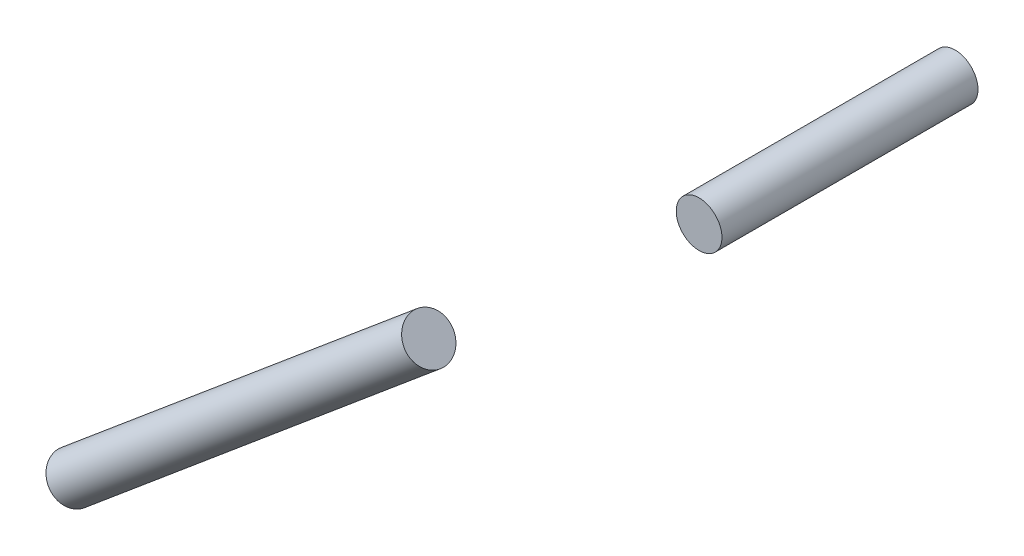
ISO-10303-21;
HEADER;
FILE_DESCRIPTION(('STEP AP214'),'2;1');
FILE_NAME('part.step','',(''),(''),'','','');
FILE_SCHEMA(('AUTOMOTIVE_DESIGN { 1 0 10303 214 1 1 1 1 }'));
ENDSEC;
DATA;
#1=APPLICATION_CONTEXT('core data for automotive mechanical design processes');
#2=APPLICATION_PROTOCOL_DEFINITION('international standard','automotive_design',2000,#1);
#3=PRODUCT_CONTEXT('',#1,'mechanical');
#4=PRODUCT('Part','Part','',(#3));
#5=PRODUCT_RELATED_PRODUCT_CATEGORY('part','',(#4));
#6=PRODUCT_DEFINITION_FORMATION('','',#4);
#7=PRODUCT_DEFINITION_CONTEXT('part definition',#1,'design');
#8=PRODUCT_DEFINITION('design','',#6,#7);
#9=PRODUCT_DEFINITION_SHAPE('','',#8);
#10=(LENGTH_UNIT() NAMED_UNIT(*) SI_UNIT(.MILLI.,.METRE.));
#11=(NAMED_UNIT(*) PLANE_ANGLE_UNIT() SI_UNIT($,.RADIAN.));
#12=(NAMED_UNIT(*) SI_UNIT($,.STERADIAN.) SOLID_ANGLE_UNIT());
#13=UNCERTAINTY_MEASURE_WITH_UNIT(LENGTH_MEASURE(1.E-05),#10,'distance_accuracy_value','');
#14=(GEOMETRIC_REPRESENTATION_CONTEXT(3) GLOBAL_UNCERTAINTY_ASSIGNED_CONTEXT((#13)) GLOBAL_UNIT_ASSIGNED_CONTEXT((#10,
#11,#12)) REPRESENTATION_CONTEXT('',''));
#15=CARTESIAN_POINT('',(0.,0.,0.));
#16=DIRECTION('',(0.,0.,1.));
#17=DIRECTION('',(1.,0.,0.));
#18=AXIS2_PLACEMENT_3D('',#15,#16,#17);
#19=CARTESIAN_POINT('',(0.,0.,-22.86));
#20=DIRECTION('',(0.,0.,-1.));
#21=DIRECTION('',(-1.,0.,0.));
#22=AXIS2_PLACEMENT_3D('',#19,#20,#21);
#23=PLANE('',#22);
#24=CARTESIAN_POINT('',(0.,0.,-22.86));
#25=DIRECTION('',(0.,0.,-1.));
#26=DIRECTION('',(-1.,0.,0.));
#27=AXIS2_PLACEMENT_3D('',#24,#25,#26);
#28=CIRCLE('',#27,6.35);
#29=CARTESIAN_POINT('',(-6.34999999999997,0.,-22.86));
#30=VERTEX_POINT('',#29);
#31=EDGE_CURVE('E11',#30,#30,#28,.F.);
#32=ORIENTED_EDGE('',*,*,#31,.F.);
#33=EDGE_LOOP('',(#32));
#34=FACE_BOUND('',#33,.T.);
#35=ADVANCED_FACE('F42',(#34),#23,.T.);
#36=CARTESIAN_POINT('',(0.,0.,48.2981000000004));
#37=DIRECTION('',(0.,0.,1.));
#38=DIRECTION('',(1.,0.,0.));
#39=AXIS2_PLACEMENT_3D('',#36,#37,#38);
#40=PLANE('',#39);
#41=CARTESIAN_POINT('',(0.,0.,48.2981000000004));
#42=DIRECTION('',(0.,0.,1.));
#43=DIRECTION('',(1.,0.,0.));
#44=AXIS2_PLACEMENT_3D('',#41,#42,#43);
#45=CIRCLE('',#44,6.35);
#46=CARTESIAN_POINT('',(6.35000000000004,0.,48.2981000000004));
#47=VERTEX_POINT('',#46);
#48=EDGE_CURVE('E48',#47,#47,#45,.T.);
#49=ORIENTED_EDGE('',*,*,#48,.T.);
#50=EDGE_LOOP('',(#49));
#51=FACE_BOUND('',#50,.T.);
#52=ADVANCED_FACE('F54',(#51),#40,.T.);
#53=CARTESIAN_POINT('',(0.,0.,-40.8205122421383));
#54=DIRECTION('',(0.,0.,1.));
#55=DIRECTION('',(1.,0.,0.));
#56=AXIS2_PLACEMENT_3D('',#53,#54,#55);
#57=CYLINDRICAL_SURFACE('',#56,6.35);
#58=ORIENTED_EDGE('',*,*,#48,.F.);
#59=EDGE_LOOP('',(#58));
#60=FACE_BOUND('',#59,.T.);
#61=ORIENTED_EDGE('',*,*,#31,.T.);
#62=EDGE_LOOP('',(#61));
#63=FACE_BOUND('',#62,.T.);
#64=ADVANCED_FACE('F56',(#60,#63),#57,.T.);
#65=CLOSED_SHELL('',(#35,#52,#64));
#66=MANIFOLD_SOLID_BREP('B2',#65);
#67=CARTESIAN_POINT('',(-48.1361902539463,-40.350838680155,61.5061000000004));
#68=DIRECTION('',(-0.766359657639559,-0.642411764480211,0.));
#69=DIRECTION('',(0.642411764480211,-0.766359657639559,0.));
#70=AXIS2_PLACEMENT_3D('',#67,#68,#69);
#71=CYLINDRICAL_SURFACE('',#70,6.35000000000001);
#72=CARTESIAN_POINT('',(-160.717192237846,-134.723447429144,61.5061000000003));
#73=DIRECTION('',(0.766359657639559,0.642411764480211,0.));
#74=DIRECTION('',(-0.642411764480211,0.766359657639559,0.));
#75=AXIS2_PLACEMENT_3D('',#72,#73,#74);
#76=CIRCLE('',#75,6.35000000000001);
#77=CARTESIAN_POINT('',(-164.796506942295,-129.857063603132,61.5061000000003));
#78=VERTEX_POINT('',#77);
#79=EDGE_CURVE('E98',#78,#78,#76,.T.);
#80=ORIENTED_EDGE('',*,*,#79,.T.);
#81=EDGE_LOOP('',(#80));
#82=FACE_BOUND('',#81,.T.);
#83=CARTESIAN_POINT('',(-61.9004022668625,-51.8888830405955,61.5061000000004));
#84=DIRECTION('',(0.76635965763956,0.64241176448021,0.));
#85=DIRECTION('',(-0.64241176448021,0.76635965763956,0.));
#86=AXIS2_PLACEMENT_3D('',#83,#84,#85);
#87=CIRCLE('',#86,6.35000000000001);
#88=CARTESIAN_POINT('',(-65.9797169713119,-47.0224992145843,61.5061000000004));
#89=VERTEX_POINT('',#88);
#90=EDGE_CURVE('E41',#89,#89,#87,.T.);
#91=ORIENTED_EDGE('',*,*,#90,.F.);
#92=EDGE_LOOP('',(#91));
#93=FACE_BOUND('',#92,.T.);
#94=ADVANCED_FACE('F91',(#82,#93),#71,.T.);
#95=CARTESIAN_POINT('',(-160.717192237846,-134.723447429144,61.5061000000003));
#96=DIRECTION('',(0.766359657639559,0.642411764480211,0.));
#97=DIRECTION('',(-0.642411764480211,0.766359657639559,0.));
#98=AXIS2_PLACEMENT_3D('',#95,#96,#97);
#99=PLANE('',#98);
#100=ORIENTED_EDGE('',*,*,#79,.F.);
#101=EDGE_LOOP('',(#100));
#102=FACE_BOUND('',#101,.T.);
#103=ADVANCED_FACE('F106',(#102),#99,.F.);
#104=CARTESIAN_POINT('',(-61.9004022668625,-51.8888830405955,0.));
#105=DIRECTION('',(0.76635965763956,0.64241176448021,0.));
#106=DIRECTION('',(-0.64241176448021,0.76635965763956,0.));
#107=AXIS2_PLACEMENT_3D('',#104,#105,#106);
#108=PLANE('',#107);
#109=ORIENTED_EDGE('',*,*,#90,.T.);
#110=EDGE_LOOP('',(#109));
#111=FACE_BOUND('',#110,.T.);
#112=ADVANCED_FACE('F93',(#111),#108,.T.);
#113=CLOSED_SHELL('',(#94,#103,#112));
#114=MANIFOLD_SOLID_BREP('B6',#113);
#115=ADVANCED_BREP_SHAPE_REPRESENTATION('',(#18,#66,#114),#14);
#116=SHAPE_DEFINITION_REPRESENTATION(#9,#115);
ENDSEC;
END-ISO-10303-21;
